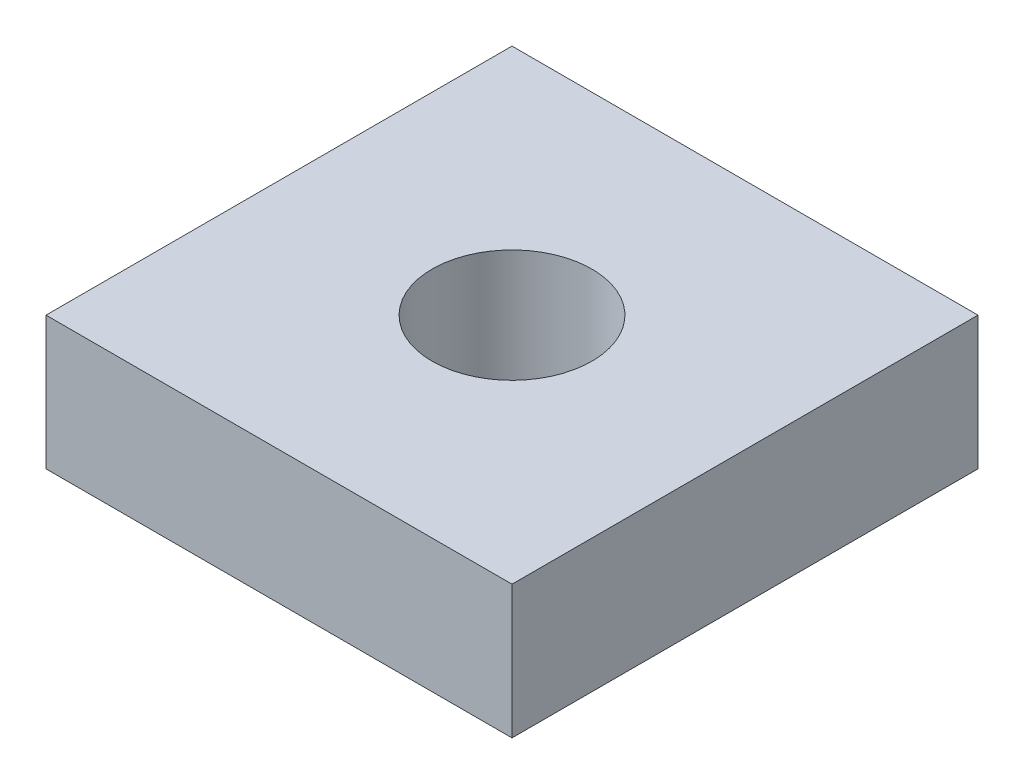
ISO-10303-21;
HEADER;
FILE_DESCRIPTION(('STEP AP214'),'2;1');
FILE_NAME('part.step','',(''),(''),'','','');
FILE_SCHEMA(('AUTOMOTIVE_DESIGN { 1 0 10303 214 1 1 1 1 }'));
ENDSEC;
DATA;
#1=APPLICATION_CONTEXT('core data for automotive mechanical design processes');
#2=APPLICATION_PROTOCOL_DEFINITION('international standard','automotive_design',2000,#1);
#3=PRODUCT_CONTEXT('',#1,'mechanical');
#4=PRODUCT('Part','Part','',(#3));
#5=PRODUCT_RELATED_PRODUCT_CATEGORY('part','',(#4));
#6=PRODUCT_DEFINITION_FORMATION('','',#4);
#7=PRODUCT_DEFINITION_CONTEXT('part definition',#1,'design');
#8=PRODUCT_DEFINITION('design','',#6,#7);
#9=PRODUCT_DEFINITION_SHAPE('','',#8);
#10=(LENGTH_UNIT() NAMED_UNIT(*) SI_UNIT(.MILLI.,.METRE.));
#11=(NAMED_UNIT(*) PLANE_ANGLE_UNIT() SI_UNIT($,.RADIAN.));
#12=(NAMED_UNIT(*) SI_UNIT($,.STERADIAN.) SOLID_ANGLE_UNIT());
#13=UNCERTAINTY_MEASURE_WITH_UNIT(LENGTH_MEASURE(1.E-05),#10,'distance_accuracy_value','');
#14=(GEOMETRIC_REPRESENTATION_CONTEXT(3) GLOBAL_UNCERTAINTY_ASSIGNED_CONTEXT((#13)) GLOBAL_UNIT_ASSIGNED_CONTEXT((#10,
#11,#12)) REPRESENTATION_CONTEXT('',''));
#15=CARTESIAN_POINT('',(0.,0.,0.));
#16=DIRECTION('',(0.,0.,1.));
#17=DIRECTION('',(1.,0.,0.));
#18=AXIS2_PLACEMENT_3D('',#15,#16,#17);
#19=CARTESIAN_POINT('',(0.,10.,0.));
#20=DIRECTION('',(0.,-1.,0.));
#21=DIRECTION('',(0.,0.,-1.));
#22=AXIS2_PLACEMENT_3D('',#19,#20,#21);
#23=PLANE('',#22);
#24=DIRECTION('',(0.,0.,-1.));
#25=VECTOR('',#24,1.);
#26=CARTESIAN_POINT('',(17.5,10.,17.5));
#27=LINE('',#26,#25);
#28=CARTESIAN_POINT('',(17.5,10.,17.5));
#29=VERTEX_POINT('',#28);
#30=CARTESIAN_POINT('',(17.5,10.,-17.5));
#31=VERTEX_POINT('',#30);
#32=EDGE_CURVE('E92',#29,#31,#27,.T.);
#33=ORIENTED_EDGE('',*,*,#32,.T.);
#34=DIRECTION('',(-1.,0.,0.));
#35=VECTOR('',#34,1.);
#36=CARTESIAN_POINT('',(-17.5,10.,-17.5));
#37=LINE('',#36,#35);
#38=CARTESIAN_POINT('',(-17.5,10.,-17.5));
#39=VERTEX_POINT('',#38);
#40=EDGE_CURVE('E87',#31,#39,#37,.T.);
#41=ORIENTED_EDGE('',*,*,#40,.T.);
#42=DIRECTION('',(0.,0.,1.));
#43=VECTOR('',#42,1.);
#44=CARTESIAN_POINT('',(-17.5,10.,17.5));
#45=LINE('',#44,#43);
#46=CARTESIAN_POINT('',(-17.5,10.,17.5));
#47=VERTEX_POINT('',#46);
#48=EDGE_CURVE('E90',#39,#47,#45,.T.);
#49=ORIENTED_EDGE('',*,*,#48,.T.);
#50=DIRECTION('',(1.,0.,0.));
#51=VECTOR('',#50,1.);
#52=CARTESIAN_POINT('',(-17.5,10.,17.5));
#53=LINE('',#52,#51);
#54=EDGE_CURVE('E57',#47,#29,#53,.T.);
#55=ORIENTED_EDGE('',*,*,#54,.T.);
#56=EDGE_LOOP('',(#33,#41,#49,#55));
#57=FACE_BOUND('',#56,.T.);
#58=CARTESIAN_POINT('',(0.,10.,0.));
#59=DIRECTION('',(0.,1.,0.));
#60=DIRECTION('',(0.,0.,1.));
#61=AXIS2_PLACEMENT_3D('',#58,#59,#60);
#62=CIRCLE('',#61,6.);
#63=CARTESIAN_POINT('',(0.,10.,6.));
#64=VERTEX_POINT('',#63);
#65=EDGE_CURVE('E112',#64,#64,#62,.T.);
#66=ORIENTED_EDGE('',*,*,#65,.F.);
#67=EDGE_LOOP('',(#66));
#68=FACE_BOUND('',#67,.T.);
#69=ADVANCED_FACE('F39',(#57,#68),#23,.F.);
#70=CARTESIAN_POINT('',(0.,0.,0.));
#71=DIRECTION('',(0.,-1.,0.));
#72=DIRECTION('',(0.,0.,-1.));
#73=AXIS2_PLACEMENT_3D('',#70,#71,#72);
#74=PLANE('',#73);
#75=DIRECTION('',(0.,0.,-1.));
#76=VECTOR('',#75,1.);
#77=CARTESIAN_POINT('',(17.5,0.,17.5));
#78=LINE('',#77,#76);
#79=CARTESIAN_POINT('',(17.5,0.,17.5));
#80=VERTEX_POINT('',#79);
#81=CARTESIAN_POINT('',(17.5,0.,-17.5));
#82=VERTEX_POINT('',#81);
#83=EDGE_CURVE('E108',#80,#82,#78,.T.);
#84=ORIENTED_EDGE('',*,*,#83,.F.);
#85=DIRECTION('',(1.,0.,0.));
#86=VECTOR('',#85,1.);
#87=CARTESIAN_POINT('',(-17.5,0.,17.5));
#88=LINE('',#87,#86);
#89=CARTESIAN_POINT('',(-17.5,0.,17.5));
#90=VERTEX_POINT('',#89);
#91=EDGE_CURVE('E80',#90,#80,#88,.T.);
#92=ORIENTED_EDGE('',*,*,#91,.F.);
#93=DIRECTION('',(0.,0.,1.));
#94=VECTOR('',#93,1.);
#95=CARTESIAN_POINT('',(-17.5,0.,17.5));
#96=LINE('',#95,#94);
#97=CARTESIAN_POINT('',(-17.5,0.,-17.5));
#98=VERTEX_POINT('',#97);
#99=EDGE_CURVE('E74',#98,#90,#96,.T.);
#100=ORIENTED_EDGE('',*,*,#99,.F.);
#101=DIRECTION('',(-1.,0.,0.));
#102=VECTOR('',#101,1.);
#103=CARTESIAN_POINT('',(-17.5,0.,-17.5));
#104=LINE('',#103,#102);
#105=EDGE_CURVE('E97',#82,#98,#104,.T.);
#106=ORIENTED_EDGE('',*,*,#105,.F.);
#107=EDGE_LOOP('',(#84,#92,#100,#106));
#108=FACE_BOUND('',#107,.T.);
#109=CARTESIAN_POINT('',(0.,0.,0.));
#110=DIRECTION('',(0.,1.,0.));
#111=DIRECTION('',(0.,0.,1.));
#112=AXIS2_PLACEMENT_3D('',#109,#110,#111);
#113=CIRCLE('',#112,6.);
#114=CARTESIAN_POINT('',(0.,0.,6.));
#115=VERTEX_POINT('',#114);
#116=EDGE_CURVE('E130',#115,#115,#113,.T.);
#117=ORIENTED_EDGE('',*,*,#116,.T.);
#118=EDGE_LOOP('',(#117));
#119=FACE_BOUND('',#118,.T.);
#120=ADVANCED_FACE('F125',(#108,#119),#74,.T.);
#121=CARTESIAN_POINT('',(17.5,10.,17.5));
#122=DIRECTION('',(-1.,0.,0.));
#123=DIRECTION('',(0.,0.,1.));
#124=AXIS2_PLACEMENT_3D('',#121,#122,#123);
#125=PLANE('',#124);
#126=ORIENTED_EDGE('',*,*,#83,.T.);
#127=DIRECTION('',(0.,-1.,0.));
#128=VECTOR('',#127,1.);
#129=CARTESIAN_POINT('',(17.5,10.,-17.5));
#130=LINE('',#129,#128);
#131=EDGE_CURVE('E11',#31,#82,#130,.T.);
#132=ORIENTED_EDGE('',*,*,#131,.F.);
#133=ORIENTED_EDGE('',*,*,#32,.F.);
#134=DIRECTION('',(0.,-1.,0.));
#135=VECTOR('',#134,1.);
#136=CARTESIAN_POINT('',(17.5,10.,17.5));
#137=LINE('',#136,#135);
#138=EDGE_CURVE('E104',#29,#80,#137,.T.);
#139=ORIENTED_EDGE('',*,*,#138,.T.);
#140=EDGE_LOOP('',(#126,#132,#133,#139));
#141=FACE_BOUND('',#140,.T.);
#142=ADVANCED_FACE('F41',(#141),#125,.F.);
#143=CARTESIAN_POINT('',(-17.5,10.,-17.5));
#144=DIRECTION('',(0.,0.,1.));
#145=DIRECTION('',(1.,0.,0.));
#146=AXIS2_PLACEMENT_3D('',#143,#144,#145);
#147=PLANE('',#146);
#148=ORIENTED_EDGE('',*,*,#105,.T.);
#149=DIRECTION('',(0.,-1.,0.));
#150=VECTOR('',#149,1.);
#151=CARTESIAN_POINT('',(-17.5,10.,-17.5));
#152=LINE('',#151,#150);
#153=EDGE_CURVE('E49',#39,#98,#152,.T.);
#154=ORIENTED_EDGE('',*,*,#153,.F.);
#155=ORIENTED_EDGE('',*,*,#40,.F.);
#156=ORIENTED_EDGE('',*,*,#131,.T.);
#157=EDGE_LOOP('',(#148,#154,#155,#156));
#158=FACE_BOUND('',#157,.T.);
#159=ADVANCED_FACE('F96',(#158),#147,.F.);
#160=CARTESIAN_POINT('',(-17.5,10.,17.5));
#161=DIRECTION('',(1.,0.,0.));
#162=DIRECTION('',(0.,0.,-1.));
#163=AXIS2_PLACEMENT_3D('',#160,#161,#162);
#164=PLANE('',#163);
#165=ORIENTED_EDGE('',*,*,#99,.T.);
#166=DIRECTION('',(0.,-1.,0.));
#167=VECTOR('',#166,1.);
#168=CARTESIAN_POINT('',(-17.5,10.,17.5));
#169=LINE('',#168,#167);
#170=EDGE_CURVE('E99',#47,#90,#169,.T.);
#171=ORIENTED_EDGE('',*,*,#170,.F.);
#172=ORIENTED_EDGE('',*,*,#48,.F.);
#173=ORIENTED_EDGE('',*,*,#153,.T.);
#174=EDGE_LOOP('',(#165,#171,#172,#173));
#175=FACE_BOUND('',#174,.T.);
#176=ADVANCED_FACE('F100',(#175),#164,.F.);
#177=CARTESIAN_POINT('',(-17.5,10.,17.5));
#178=DIRECTION('',(0.,0.,-1.));
#179=DIRECTION('',(-1.,0.,0.));
#180=AXIS2_PLACEMENT_3D('',#177,#178,#179);
#181=PLANE('',#180);
#182=ORIENTED_EDGE('',*,*,#91,.T.);
#183=ORIENTED_EDGE('',*,*,#138,.F.);
#184=ORIENTED_EDGE('',*,*,#54,.F.);
#185=ORIENTED_EDGE('',*,*,#170,.T.);
#186=EDGE_LOOP('',(#182,#183,#184,#185));
#187=FACE_BOUND('',#186,.T.);
#188=ADVANCED_FACE('F122',(#187),#181,.F.);
#189=CARTESIAN_POINT('',(0.,10.,0.));
#190=DIRECTION('',(0.,-1.,0.));
#191=DIRECTION('',(0.,0.,-1.));
#192=AXIS2_PLACEMENT_3D('',#189,#190,#191);
#193=CYLINDRICAL_SURFACE('',#192,6.);
#194=ORIENTED_EDGE('',*,*,#65,.T.);
#195=EDGE_LOOP('',(#194));
#196=FACE_BOUND('',#195,.T.);
#197=ORIENTED_EDGE('',*,*,#116,.F.);
#198=EDGE_LOOP('',(#197));
#199=FACE_BOUND('',#198,.T.);
#200=ADVANCED_FACE('F138',(#196,#199),#193,.F.);
#201=CLOSED_SHELL('',(#69,#120,#142,#159,#176,#188,#200));
#202=MANIFOLD_SOLID_BREP('B2',#201);
#203=ADVANCED_BREP_SHAPE_REPRESENTATION('',(#18,#202),#14);
#204=SHAPE_DEFINITION_REPRESENTATION(#9,#203);
ENDSEC;
END-ISO-10303-21;
